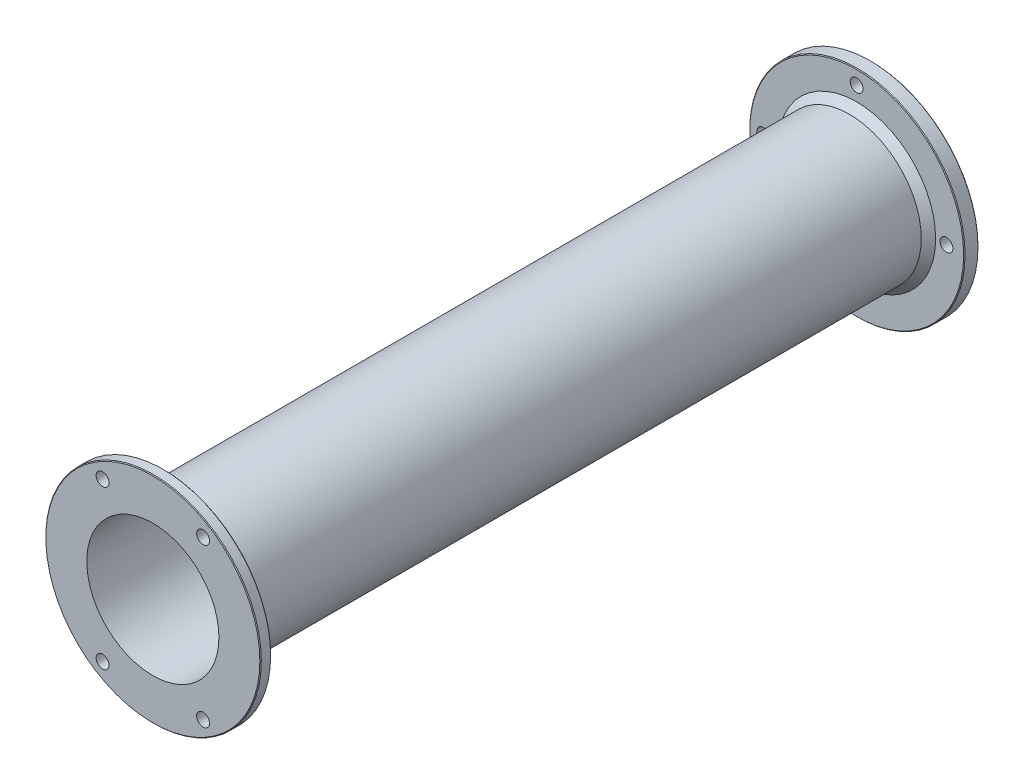
ISO-10303-21;
HEADER;
FILE_DESCRIPTION(('STEP AP214'),'2;1');
FILE_NAME('part.step','',(''),(''),'','','');
FILE_SCHEMA(('AUTOMOTIVE_DESIGN { 1 0 10303 214 1 1 1 1 }'));
ENDSEC;
DATA;
#1=APPLICATION_CONTEXT('core data for automotive mechanical design processes');
#2=APPLICATION_PROTOCOL_DEFINITION('international standard','automotive_design',2000,#1);
#3=PRODUCT_CONTEXT('',#1,'mechanical');
#4=PRODUCT('Part','Part','',(#3));
#5=PRODUCT_RELATED_PRODUCT_CATEGORY('part','',(#4));
#6=PRODUCT_DEFINITION_FORMATION('','',#4);
#7=PRODUCT_DEFINITION_CONTEXT('part definition',#1,'design');
#8=PRODUCT_DEFINITION('design','',#6,#7);
#9=PRODUCT_DEFINITION_SHAPE('','',#8);
#10=(LENGTH_UNIT() NAMED_UNIT(*) SI_UNIT(.MILLI.,.METRE.));
#11=(NAMED_UNIT(*) PLANE_ANGLE_UNIT() SI_UNIT($,.RADIAN.));
#12=(NAMED_UNIT(*) SI_UNIT($,.STERADIAN.) SOLID_ANGLE_UNIT());
#13=UNCERTAINTY_MEASURE_WITH_UNIT(LENGTH_MEASURE(1.E-05),#10,'distance_accuracy_value','');
#14=(GEOMETRIC_REPRESENTATION_CONTEXT(3) GLOBAL_UNCERTAINTY_ASSIGNED_CONTEXT((#13)) GLOBAL_UNIT_ASSIGNED_CONTEXT((#10,
#11,#12)) REPRESENTATION_CONTEXT('',''));
#15=CARTESIAN_POINT('',(0.,0.,0.));
#16=DIRECTION('',(0.,0.,1.));
#17=DIRECTION('',(1.,0.,0.));
#18=AXIS2_PLACEMENT_3D('',#15,#16,#17);
#19=CARTESIAN_POINT('',(0.,0.,20.));
#20=DIRECTION('',(0.,0.,1.));
#21=DIRECTION('',(1.,0.,0.));
#22=AXIS2_PLACEMENT_3D('',#19,#20,#21);
#23=PLANE('',#22);
#24=CARTESIAN_POINT('',(0.,0.,20.));
#25=DIRECTION('',(0.,0.,1.));
#26=DIRECTION('',(1.,0.,0.));
#27=AXIS2_PLACEMENT_3D('',#24,#25,#26);
#28=CIRCLE('',#27,149.);
#29=CARTESIAN_POINT('',(149.,0.,20.));
#30=VERTEX_POINT('',#29);
#31=EDGE_CURVE('E70',#30,#30,#28,.T.);
#32=ORIENTED_EDGE('',*,*,#31,.T.);
#33=EDGE_LOOP('',(#32));
#34=FACE_BOUND('',#33,.T.);
#35=CARTESIAN_POINT('',(0.,0.,20.));
#36=DIRECTION('',(0.,0.,1.));
#37=DIRECTION('',(1.,0.,0.));
#38=AXIS2_PLACEMENT_3D('',#35,#36,#37);
#39=CIRCLE('',#38,110.);
#40=CARTESIAN_POINT('',(110.,0.,20.));
#41=VERTEX_POINT('',#40);
#42=EDGE_CURVE('E86',#41,#41,#39,.F.);
#43=ORIENTED_EDGE('',*,*,#42,.T.);
#44=EDGE_LOOP('',(#43));
#45=FACE_BOUND('',#44,.T.);
#46=CARTESIAN_POINT('',(-130.,5.00000000000007,20.));
#47=DIRECTION('',(0.,0.,1.));
#48=DIRECTION('',(1.,0.,0.));
#49=AXIS2_PLACEMENT_3D('',#46,#47,#48);
#50=CIRCLE('',#49,9.00000000000001);
#51=CARTESIAN_POINT('',(-121.,5.00000000000007,20.));
#52=VERTEX_POINT('',#51);
#53=EDGE_CURVE('E127',#52,#52,#50,.T.);
#54=ORIENTED_EDGE('',*,*,#53,.F.);
#55=EDGE_LOOP('',(#54));
#56=FACE_BOUND('',#55,.T.);
#57=CARTESIAN_POINT('',(125.,-4.36435167355392E-13,20.));
#58=DIRECTION('',(0.,0.,1.));
#59=DIRECTION('',(1.,0.,0.));
#60=AXIS2_PLACEMENT_3D('',#57,#58,#59);
#61=CIRCLE('',#60,9.00000000000001);
#62=CARTESIAN_POINT('',(134.,-4.36435167355392E-13,20.));
#63=VERTEX_POINT('',#62);
#64=EDGE_CURVE('E111',#63,#63,#61,.T.);
#65=ORIENTED_EDGE('',*,*,#64,.F.);
#66=EDGE_LOOP('',(#65));
#67=FACE_BOUND('',#66,.T.);
#68=CARTESIAN_POINT('',(0.,130.,20.));
#69=DIRECTION('',(0.,0.,1.));
#70=DIRECTION('',(1.,0.,0.));
#71=AXIS2_PLACEMENT_3D('',#68,#69,#70);
#72=CIRCLE('',#71,9.00000000000001);
#73=CARTESIAN_POINT('',(9.00000000000001,130.,20.));
#74=VERTEX_POINT('',#73);
#75=EDGE_CURVE('E106',#74,#74,#72,.T.);
#76=ORIENTED_EDGE('',*,*,#75,.F.);
#77=EDGE_LOOP('',(#76));
#78=FACE_BOUND('',#77,.T.);
#79=CARTESIAN_POINT('',(-5.00000000000045,-125.,20.));
#80=DIRECTION('',(0.,0.,1.));
#81=DIRECTION('',(1.,0.,0.));
#82=AXIS2_PLACEMENT_3D('',#79,#80,#81);
#83=CIRCLE('',#82,8.99999999999999);
#84=CARTESIAN_POINT('',(3.99999999999954,-125.,20.));
#85=VERTEX_POINT('',#84);
#86=EDGE_CURVE('E119',#85,#85,#83,.T.);
#87=ORIENTED_EDGE('',*,*,#86,.F.);
#88=EDGE_LOOP('',(#87));
#89=FACE_BOUND('',#88,.T.);
#90=ADVANCED_FACE('F45',(#34,#45,#56,#67,#78,#89),#23,.T.);
#91=CARTESIAN_POINT('',(0.,0.,0.));
#92=DIRECTION('',(0.,0.,1.));
#93=DIRECTION('',(1.,0.,0.));
#94=AXIS2_PLACEMENT_3D('',#91,#92,#93);
#95=PLANE('',#94);
#96=CARTESIAN_POINT('',(0.,0.,0.));
#97=DIRECTION('',(0.,0.,1.));
#98=DIRECTION('',(1.,0.,0.));
#99=AXIS2_PLACEMENT_3D('',#96,#97,#98);
#100=CIRCLE('',#99,149.);
#101=CARTESIAN_POINT('',(149.,0.,0.));
#102=VERTEX_POINT('',#101);
#103=EDGE_CURVE('E74',#102,#102,#100,.F.);
#104=ORIENTED_EDGE('',*,*,#103,.T.);
#105=EDGE_LOOP('',(#104));
#106=FACE_BOUND('',#105,.T.);
#107=CARTESIAN_POINT('',(0.,0.,0.));
#108=DIRECTION('',(0.,0.,1.));
#109=DIRECTION('',(1.,0.,0.));
#110=AXIS2_PLACEMENT_3D('',#107,#108,#109);
#111=CIRCLE('',#110,92.);
#112=CARTESIAN_POINT('',(92.,0.,0.));
#113=VERTEX_POINT('',#112);
#114=EDGE_CURVE('E102',#113,#113,#111,.T.);
#115=ORIENTED_EDGE('',*,*,#114,.T.);
#116=EDGE_LOOP('',(#115));
#117=FACE_BOUND('',#116,.T.);
#118=CARTESIAN_POINT('',(0.,130.,0.));
#119=DIRECTION('',(0.,0.,1.));
#120=DIRECTION('',(1.,0.,0.));
#121=AXIS2_PLACEMENT_3D('',#118,#119,#120);
#122=CIRCLE('',#121,9.00000000000001);
#123=CARTESIAN_POINT('',(9.00000000000001,130.,0.));
#124=VERTEX_POINT('',#123);
#125=EDGE_CURVE('E107',#124,#124,#122,.T.);
#126=ORIENTED_EDGE('',*,*,#125,.T.);
#127=EDGE_LOOP('',(#126));
#128=FACE_BOUND('',#127,.T.);
#129=CARTESIAN_POINT('',(125.,-4.36435167355392E-13,0.));
#130=DIRECTION('',(0.,0.,1.));
#131=DIRECTION('',(1.,0.,0.));
#132=AXIS2_PLACEMENT_3D('',#129,#130,#131);
#133=CIRCLE('',#132,9.00000000000001);
#134=CARTESIAN_POINT('',(134.,-4.36435167355392E-13,0.));
#135=VERTEX_POINT('',#134);
#136=EDGE_CURVE('E115',#135,#135,#133,.T.);
#137=ORIENTED_EDGE('',*,*,#136,.T.);
#138=EDGE_LOOP('',(#137));
#139=FACE_BOUND('',#138,.T.);
#140=CARTESIAN_POINT('',(-5.00000000000045,-125.,0.));
#141=DIRECTION('',(0.,0.,1.));
#142=DIRECTION('',(1.,0.,0.));
#143=AXIS2_PLACEMENT_3D('',#140,#141,#142);
#144=CIRCLE('',#143,8.99999999999999);
#145=CARTESIAN_POINT('',(3.99999999999954,-125.,0.));
#146=VERTEX_POINT('',#145);
#147=EDGE_CURVE('E123',#146,#146,#144,.T.);
#148=ORIENTED_EDGE('',*,*,#147,.T.);
#149=EDGE_LOOP('',(#148));
#150=FACE_BOUND('',#149,.T.);
#151=CARTESIAN_POINT('',(-130.,5.00000000000007,0.));
#152=DIRECTION('',(0.,0.,1.));
#153=DIRECTION('',(1.,0.,0.));
#154=AXIS2_PLACEMENT_3D('',#151,#152,#153);
#155=CIRCLE('',#154,9.00000000000001);
#156=CARTESIAN_POINT('',(-121.,5.00000000000007,0.));
#157=VERTEX_POINT('',#156);
#158=EDGE_CURVE('E131',#157,#157,#155,.T.);
#159=ORIENTED_EDGE('',*,*,#158,.T.);
#160=EDGE_LOOP('',(#159));
#161=FACE_BOUND('',#160,.T.);
#162=ADVANCED_FACE('F196',(#106,#117,#128,#139,#150,#161),#95,.F.);
#163=CARTESIAN_POINT('',(0.,0.,20.));
#164=DIRECTION('',(0.,0.,-1.));
#165=DIRECTION('',(-1.,0.,0.));
#166=AXIS2_PLACEMENT_3D('',#163,#164,#165);
#167=CYLINDRICAL_SURFACE('',#166,150.);
#168=CARTESIAN_POINT('',(0.,0.,0.99999999999989));
#169=DIRECTION('',(0.,0.,1.));
#170=DIRECTION('',(1.,0.,0.));
#171=AXIS2_PLACEMENT_3D('',#168,#169,#170);
#172=CIRCLE('',#171,150.);
#173=CARTESIAN_POINT('',(150.,0.,0.99999999999989));
#174=VERTEX_POINT('',#173);
#175=EDGE_CURVE('E78',#174,#174,#172,.T.);
#176=ORIENTED_EDGE('',*,*,#175,.T.);
#177=EDGE_LOOP('',(#176));
#178=FACE_BOUND('',#177,.T.);
#179=CARTESIAN_POINT('',(0.,0.,18.9999999999998));
#180=DIRECTION('',(0.,0.,1.));
#181=DIRECTION('',(1.,0.,0.));
#182=AXIS2_PLACEMENT_3D('',#179,#180,#181);
#183=CIRCLE('',#182,150.);
#184=CARTESIAN_POINT('',(150.,0.,18.9999999999998));
#185=VERTEX_POINT('',#184);
#186=EDGE_CURVE('E82',#185,#185,#183,.F.);
#187=ORIENTED_EDGE('',*,*,#186,.T.);
#188=EDGE_LOOP('',(#187));
#189=FACE_BOUND('',#188,.T.);
#190=ADVANCED_FACE('F203',(#178,#189),#167,.T.);
#191=CARTESIAN_POINT('',(0.,0.,20.));
#192=DIRECTION('',(0.,0.,-1.));
#193=DIRECTION('',(-1.,0.,0.));
#194=AXIS2_PLACEMENT_3D('',#191,#192,#193);
#195=CYLINDRICAL_SURFACE('',#194,92.);
#196=ORIENTED_EDGE('',*,*,#114,.F.);
#197=EDGE_LOOP('',(#196));
#198=FACE_BOUND('',#197,.T.);
#199=CARTESIAN_POINT('',(0.,0.,1000.));
#200=DIRECTION('',(0.,0.,1.));
#201=DIRECTION('',(1.,0.,0.));
#202=AXIS2_PLACEMENT_3D('',#199,#200,#201);
#203=CIRCLE('',#202,92.);
#204=CARTESIAN_POINT('',(92.,0.,1000.));
#205=VERTEX_POINT('',#204);
#206=EDGE_CURVE('E135',#205,#205,#203,.T.);
#207=ORIENTED_EDGE('',*,*,#206,.T.);
#208=EDGE_LOOP('',(#207));
#209=FACE_BOUND('',#208,.T.);
#210=ADVANCED_FACE('F208',(#198,#209),#195,.F.);
#211=CARTESIAN_POINT('',(0.,130.,20.));
#212=DIRECTION('',(0.,0.,-1.));
#213=DIRECTION('',(-1.,0.,0.));
#214=AXIS2_PLACEMENT_3D('',#211,#212,#213);
#215=CYLINDRICAL_SURFACE('',#214,9.00000000000001);
#216=ORIENTED_EDGE('',*,*,#75,.T.);
#217=EDGE_LOOP('',(#216));
#218=FACE_BOUND('',#217,.T.);
#219=ORIENTED_EDGE('',*,*,#125,.F.);
#220=EDGE_LOOP('',(#219));
#221=FACE_BOUND('',#220,.T.);
#222=ADVANCED_FACE('F273',(#218,#221),#215,.F.);
#223=CARTESIAN_POINT('',(125.,-4.36435167355392E-13,20.));
#224=DIRECTION('',(0.,0.,-1.));
#225=DIRECTION('',(-1.,0.,0.));
#226=AXIS2_PLACEMENT_3D('',#223,#224,#225);
#227=CYLINDRICAL_SURFACE('',#226,9.00000000000001);
#228=ORIENTED_EDGE('',*,*,#64,.T.);
#229=EDGE_LOOP('',(#228));
#230=FACE_BOUND('',#229,.T.);
#231=ORIENTED_EDGE('',*,*,#136,.F.);
#232=EDGE_LOOP('',(#231));
#233=FACE_BOUND('',#232,.T.);
#234=ADVANCED_FACE('F270',(#230,#233),#227,.F.);
#235=CARTESIAN_POINT('',(-5.00000000000045,-125.,20.));
#236=DIRECTION('',(0.,0.,-1.));
#237=DIRECTION('',(-1.,0.,0.));
#238=AXIS2_PLACEMENT_3D('',#235,#236,#237);
#239=CYLINDRICAL_SURFACE('',#238,8.99999999999999);
#240=ORIENTED_EDGE('',*,*,#86,.T.);
#241=EDGE_LOOP('',(#240));
#242=FACE_BOUND('',#241,.T.);
#243=ORIENTED_EDGE('',*,*,#147,.F.);
#244=EDGE_LOOP('',(#243));
#245=FACE_BOUND('',#244,.T.);
#246=ADVANCED_FACE('F266',(#242,#245),#239,.F.);
#247=CARTESIAN_POINT('',(-130.,5.00000000000007,20.));
#248=DIRECTION('',(0.,0.,-1.));
#249=DIRECTION('',(-1.,0.,0.));
#250=AXIS2_PLACEMENT_3D('',#247,#248,#249);
#251=CYLINDRICAL_SURFACE('',#250,9.00000000000001);
#252=ORIENTED_EDGE('',*,*,#53,.T.);
#253=EDGE_LOOP('',(#252));
#254=FACE_BOUND('',#253,.T.);
#255=ORIENTED_EDGE('',*,*,#158,.F.);
#256=EDGE_LOOP('',(#255));
#257=FACE_BOUND('',#256,.T.);
#258=ADVANCED_FACE('F190',(#254,#257),#251,.F.);
#259=CARTESIAN_POINT('',(0.,0.,985.));
#260=DIRECTION('',(0.,0.,-1.));
#261=DIRECTION('',(-1.,0.,0.));
#262=AXIS2_PLACEMENT_3D('',#259,#260,#261);
#263=CYLINDRICAL_SURFACE('',#262,100.);
#264=CARTESIAN_POINT('',(0.,0.,975.));
#265=DIRECTION('',(0.,0.,1.));
#266=DIRECTION('',(1.,0.,0.));
#267=AXIS2_PLACEMENT_3D('',#264,#265,#266);
#268=CIRCLE('',#267,100.);
#269=CARTESIAN_POINT('',(100.,0.,975.));
#270=VERTEX_POINT('',#269);
#271=EDGE_CURVE('E90',#270,#270,#268,.F.);
#272=ORIENTED_EDGE('',*,*,#271,.T.);
#273=EDGE_LOOP('',(#272));
#274=FACE_BOUND('',#273,.T.);
#275=CARTESIAN_POINT('',(0.,0.,29.9999999999999));
#276=DIRECTION('',(0.,0.,1.));
#277=DIRECTION('',(1.,0.,0.));
#278=AXIS2_PLACEMENT_3D('',#275,#276,#277);
#279=CIRCLE('',#278,100.);
#280=CARTESIAN_POINT('',(100.,0.,29.9999999999999));
#281=VERTEX_POINT('',#280);
#282=EDGE_CURVE('E94',#281,#281,#279,.T.);
#283=ORIENTED_EDGE('',*,*,#282,.T.);
#284=EDGE_LOOP('',(#283));
#285=FACE_BOUND('',#284,.T.);
#286=ADVANCED_FACE('F181',(#274,#285),#263,.T.);
#287=CARTESIAN_POINT('',(0.,0.,1000.));
#288=DIRECTION('',(0.,0.,1.));
#289=DIRECTION('',(1.,0.,0.));
#290=AXIS2_PLACEMENT_3D('',#287,#288,#289);
#291=PLANE('',#290);
#292=CARTESIAN_POINT('',(0.,0.,1000.));
#293=DIRECTION('',(0.,0.,1.));
#294=DIRECTION('',(1.,0.,0.));
#295=AXIS2_PLACEMENT_3D('',#292,#293,#294);
#296=CIRCLE('',#295,149.);
#297=CARTESIAN_POINT('',(149.,0.,1000.));
#298=VERTEX_POINT('',#297);
#299=EDGE_CURVE('E10',#298,#298,#296,.T.);
#300=ORIENTED_EDGE('',*,*,#299,.T.);
#301=EDGE_LOOP('',(#300));
#302=FACE_BOUND('',#301,.T.);
#303=CARTESIAN_POINT('',(70.,-110.,1000.));
#304=DIRECTION('',(0.,0.,1.));
#305=DIRECTION('',(1.,0.,0.));
#306=AXIS2_PLACEMENT_3D('',#303,#304,#305);
#307=CIRCLE('',#306,8.99999999999999);
#308=CARTESIAN_POINT('',(79.,-110.,1000.));
#309=VERTEX_POINT('',#308);
#310=EDGE_CURVE('E155',#309,#309,#307,.T.);
#311=ORIENTED_EDGE('',*,*,#310,.F.);
#312=EDGE_LOOP('',(#311));
#313=FACE_BOUND('',#312,.T.);
#314=CARTESIAN_POINT('',(-70.,110.,1000.));
#315=DIRECTION('',(0.,0.,1.));
#316=DIRECTION('',(1.,0.,0.));
#317=AXIS2_PLACEMENT_3D('',#314,#315,#316);
#318=CIRCLE('',#317,9.00000000000001);
#319=CARTESIAN_POINT('',(-61.,110.,1000.));
#320=VERTEX_POINT('',#319);
#321=EDGE_CURVE('E142',#320,#320,#318,.T.);
#322=ORIENTED_EDGE('',*,*,#321,.F.);
#323=EDGE_LOOP('',(#322));
#324=FACE_BOUND('',#323,.T.);
#325=ORIENTED_EDGE('',*,*,#206,.F.);
#326=EDGE_LOOP('',(#325));
#327=FACE_BOUND('',#326,.T.);
#328=CARTESIAN_POINT('',(70.,110.,1000.));
#329=DIRECTION('',(0.,0.,1.));
#330=DIRECTION('',(1.,0.,0.));
#331=AXIS2_PLACEMENT_3D('',#328,#329,#330);
#332=CIRCLE('',#331,8.99999999999999);
#333=CARTESIAN_POINT('',(79.,110.,1000.));
#334=VERTEX_POINT('',#333);
#335=EDGE_CURVE('E147',#334,#334,#332,.T.);
#336=ORIENTED_EDGE('',*,*,#335,.F.);
#337=EDGE_LOOP('',(#336));
#338=FACE_BOUND('',#337,.T.);
#339=CARTESIAN_POINT('',(-70.,-110.,1000.));
#340=DIRECTION('',(0.,0.,1.));
#341=DIRECTION('',(1.,0.,0.));
#342=AXIS2_PLACEMENT_3D('',#339,#340,#341);
#343=CIRCLE('',#342,9.00000000000001);
#344=CARTESIAN_POINT('',(-61.,-110.,1000.));
#345=VERTEX_POINT('',#344);
#346=EDGE_CURVE('E163',#345,#345,#343,.T.);
#347=ORIENTED_EDGE('',*,*,#346,.F.);
#348=EDGE_LOOP('',(#347));
#349=FACE_BOUND('',#348,.T.);
#350=ADVANCED_FACE('F178',(#302,#313,#324,#327,#338,#349),#291,.T.);
#351=CARTESIAN_POINT('',(0.,0.,985.));
#352=DIRECTION('',(0.,0.,1.));
#353=DIRECTION('',(1.,0.,0.));
#354=AXIS2_PLACEMENT_3D('',#351,#352,#353);
#355=PLANE('',#354);
#356=CARTESIAN_POINT('',(0.,0.,985.));
#357=DIRECTION('',(0.,0.,1.));
#358=DIRECTION('',(1.,0.,0.));
#359=AXIS2_PLACEMENT_3D('',#356,#357,#358);
#360=CIRCLE('',#359,149.);
#361=CARTESIAN_POINT('',(149.,0.,985.));
#362=VERTEX_POINT('',#361);
#363=EDGE_CURVE('E54',#362,#362,#360,.F.);
#364=ORIENTED_EDGE('',*,*,#363,.T.);
#365=EDGE_LOOP('',(#364));
#366=FACE_BOUND('',#365,.T.);
#367=CARTESIAN_POINT('',(0.,0.,985.));
#368=DIRECTION('',(0.,0.,1.));
#369=DIRECTION('',(1.,0.,0.));
#370=AXIS2_PLACEMENT_3D('',#367,#368,#369);
#371=CIRCLE('',#370,110.);
#372=CARTESIAN_POINT('',(110.,0.,985.));
#373=VERTEX_POINT('',#372);
#374=EDGE_CURVE('E98',#373,#373,#371,.T.);
#375=ORIENTED_EDGE('',*,*,#374,.T.);
#376=EDGE_LOOP('',(#375));
#377=FACE_BOUND('',#376,.T.);
#378=CARTESIAN_POINT('',(-70.,110.,985.));
#379=DIRECTION('',(0.,0.,1.));
#380=DIRECTION('',(1.,0.,0.));
#381=AXIS2_PLACEMENT_3D('',#378,#379,#380);
#382=CIRCLE('',#381,9.00000000000001);
#383=CARTESIAN_POINT('',(-61.,110.,985.));
#384=VERTEX_POINT('',#383);
#385=EDGE_CURVE('E143',#384,#384,#382,.T.);
#386=ORIENTED_EDGE('',*,*,#385,.T.);
#387=EDGE_LOOP('',(#386));
#388=FACE_BOUND('',#387,.T.);
#389=CARTESIAN_POINT('',(70.,110.,985.));
#390=DIRECTION('',(0.,0.,1.));
#391=DIRECTION('',(1.,0.,0.));
#392=AXIS2_PLACEMENT_3D('',#389,#390,#391);
#393=CIRCLE('',#392,8.99999999999999);
#394=CARTESIAN_POINT('',(79.,110.,985.));
#395=VERTEX_POINT('',#394);
#396=EDGE_CURVE('E151',#395,#395,#393,.T.);
#397=ORIENTED_EDGE('',*,*,#396,.T.);
#398=EDGE_LOOP('',(#397));
#399=FACE_BOUND('',#398,.T.);
#400=CARTESIAN_POINT('',(70.,-110.,985.));
#401=DIRECTION('',(0.,0.,1.));
#402=DIRECTION('',(1.,0.,0.));
#403=AXIS2_PLACEMENT_3D('',#400,#401,#402);
#404=CIRCLE('',#403,8.99999999999999);
#405=CARTESIAN_POINT('',(79.,-110.,985.));
#406=VERTEX_POINT('',#405);
#407=EDGE_CURVE('E159',#406,#406,#404,.T.);
#408=ORIENTED_EDGE('',*,*,#407,.T.);
#409=EDGE_LOOP('',(#408));
#410=FACE_BOUND('',#409,.T.);
#411=CARTESIAN_POINT('',(-70.,-110.,985.));
#412=DIRECTION('',(0.,0.,1.));
#413=DIRECTION('',(1.,0.,0.));
#414=AXIS2_PLACEMENT_3D('',#411,#412,#413);
#415=CIRCLE('',#414,9.00000000000001);
#416=CARTESIAN_POINT('',(-61.,-110.,985.));
#417=VERTEX_POINT('',#416);
#418=EDGE_CURVE('E167',#417,#417,#415,.T.);
#419=ORIENTED_EDGE('',*,*,#418,.T.);
#420=EDGE_LOOP('',(#419));
#421=FACE_BOUND('',#420,.T.);
#422=ADVANCED_FACE('F180',(#366,#377,#388,#399,#410,#421),#355,.F.);
#423=CARTESIAN_POINT('',(0.,0.,1000.));
#424=DIRECTION('',(0.,0.,-1.));
#425=DIRECTION('',(-1.,0.,0.));
#426=AXIS2_PLACEMENT_3D('',#423,#424,#425);
#427=CYLINDRICAL_SURFACE('',#426,150.);
#428=CARTESIAN_POINT('',(0.,0.,986.));
#429=DIRECTION('',(0.,0.,1.));
#430=DIRECTION('',(1.,0.,0.));
#431=AXIS2_PLACEMENT_3D('',#428,#429,#430);
#432=CIRCLE('',#431,150.);
#433=CARTESIAN_POINT('',(150.,0.,986.));
#434=VERTEX_POINT('',#433);
#435=EDGE_CURVE('E59',#434,#434,#432,.T.);
#436=ORIENTED_EDGE('',*,*,#435,.T.);
#437=EDGE_LOOP('',(#436));
#438=FACE_BOUND('',#437,.T.);
#439=CARTESIAN_POINT('',(0.,0.,999.));
#440=DIRECTION('',(0.,0.,1.));
#441=DIRECTION('',(1.,0.,0.));
#442=AXIS2_PLACEMENT_3D('',#439,#440,#441);
#443=CIRCLE('',#442,150.);
#444=CARTESIAN_POINT('',(150.,0.,999.));
#445=VERTEX_POINT('',#444);
#446=EDGE_CURVE('E64',#445,#445,#443,.F.);
#447=ORIENTED_EDGE('',*,*,#446,.T.);
#448=EDGE_LOOP('',(#447));
#449=FACE_BOUND('',#448,.T.);
#450=ADVANCED_FACE('F187',(#438,#449),#427,.T.);
#451=CARTESIAN_POINT('',(-70.,110.,1000.));
#452=DIRECTION('',(0.,0.,-1.));
#453=DIRECTION('',(-1.,0.,0.));
#454=AXIS2_PLACEMENT_3D('',#451,#452,#453);
#455=CYLINDRICAL_SURFACE('',#454,9.00000000000001);
#456=ORIENTED_EDGE('',*,*,#321,.T.);
#457=EDGE_LOOP('',(#456));
#458=FACE_BOUND('',#457,.T.);
#459=ORIENTED_EDGE('',*,*,#385,.F.);
#460=EDGE_LOOP('',(#459));
#461=FACE_BOUND('',#460,.T.);
#462=ADVANCED_FACE('F254',(#458,#461),#455,.F.);
#463=CARTESIAN_POINT('',(70.,110.,1000.));
#464=DIRECTION('',(0.,0.,-1.));
#465=DIRECTION('',(-1.,0.,0.));
#466=AXIS2_PLACEMENT_3D('',#463,#464,#465);
#467=CYLINDRICAL_SURFACE('',#466,8.99999999999999);
#468=ORIENTED_EDGE('',*,*,#335,.T.);
#469=EDGE_LOOP('',(#468));
#470=FACE_BOUND('',#469,.T.);
#471=ORIENTED_EDGE('',*,*,#396,.F.);
#472=EDGE_LOOP('',(#471));
#473=FACE_BOUND('',#472,.T.);
#474=ADVANCED_FACE('F261',(#470,#473),#467,.F.);
#475=CARTESIAN_POINT('',(70.,-110.,1000.));
#476=DIRECTION('',(0.,0.,-1.));
#477=DIRECTION('',(-1.,0.,0.));
#478=AXIS2_PLACEMENT_3D('',#475,#476,#477);
#479=CYLINDRICAL_SURFACE('',#478,8.99999999999999);
#480=ORIENTED_EDGE('',*,*,#310,.T.);
#481=EDGE_LOOP('',(#480));
#482=FACE_BOUND('',#481,.T.);
#483=ORIENTED_EDGE('',*,*,#407,.F.);
#484=EDGE_LOOP('',(#483));
#485=FACE_BOUND('',#484,.T.);
#486=ADVANCED_FACE('F308',(#482,#485),#479,.F.);
#487=CARTESIAN_POINT('',(-70.,-110.,1000.));
#488=DIRECTION('',(0.,0.,-1.));
#489=DIRECTION('',(-1.,0.,0.));
#490=AXIS2_PLACEMENT_3D('',#487,#488,#489);
#491=CYLINDRICAL_SURFACE('',#490,9.00000000000001);
#492=ORIENTED_EDGE('',*,*,#346,.T.);
#493=EDGE_LOOP('',(#492));
#494=FACE_BOUND('',#493,.T.);
#495=ORIENTED_EDGE('',*,*,#418,.F.);
#496=EDGE_LOOP('',(#495));
#497=FACE_BOUND('',#496,.T.);
#498=ADVANCED_FACE('F175',(#494,#497),#491,.F.);
#499=CARTESIAN_POINT('',(0.,0.,985.));
#500=DIRECTION('',(0.,0.,1.));
#501=DIRECTION('',(1.,0.,0.));
#502=AXIS2_PLACEMENT_3D('',#499,#500,#501);
#503=CONICAL_SURFACE('',#502,110.,0.785398163397457);
#504=ORIENTED_EDGE('',*,*,#271,.F.);
#505=EDGE_LOOP('',(#504));
#506=FACE_BOUND('',#505,.T.);
#507=ORIENTED_EDGE('',*,*,#374,.F.);
#508=EDGE_LOOP('',(#507));
#509=FACE_BOUND('',#508,.T.);
#510=ADVANCED_FACE('F214',(#506,#509),#503,.T.);
#511=CARTESIAN_POINT('',(0.,0.,29.9999999999999));
#512=DIRECTION('',(0.,0.,-1.));
#513=DIRECTION('',(-1.,0.,0.));
#514=AXIS2_PLACEMENT_3D('',#511,#512,#513);
#515=CONICAL_SURFACE('',#514,100.,0.785398163397448);
#516=ORIENTED_EDGE('',*,*,#42,.F.);
#517=EDGE_LOOP('',(#516));
#518=FACE_BOUND('',#517,.T.);
#519=ORIENTED_EDGE('',*,*,#282,.F.);
#520=EDGE_LOOP('',(#519));
#521=FACE_BOUND('',#520,.T.);
#522=ADVANCED_FACE('F220',(#518,#521),#515,.T.);
#523=CARTESIAN_POINT('',(0.,0.,0.99999999999989));
#524=DIRECTION('',(0.,0.,1.));
#525=DIRECTION('',(1.,0.,0.));
#526=AXIS2_PLACEMENT_3D('',#523,#524,#525);
#527=CONICAL_SURFACE('',#526,150.,0.785398163397421);
#528=ORIENTED_EDGE('',*,*,#103,.F.);
#529=EDGE_LOOP('',(#528));
#530=FACE_BOUND('',#529,.T.);
#531=ORIENTED_EDGE('',*,*,#175,.F.);
#532=EDGE_LOOP('',(#531));
#533=FACE_BOUND('',#532,.T.);
#534=ADVANCED_FACE('F226',(#530,#533),#527,.T.);
#535=CARTESIAN_POINT('',(0.,0.,20.));
#536=DIRECTION('',(0.,0.,-1.));
#537=DIRECTION('',(-1.,0.,0.));
#538=AXIS2_PLACEMENT_3D('',#535,#536,#537);
#539=CONICAL_SURFACE('',#538,149.,0.785398163397421);
#540=ORIENTED_EDGE('',*,*,#186,.F.);
#541=EDGE_LOOP('',(#540));
#542=FACE_BOUND('',#541,.T.);
#543=ORIENTED_EDGE('',*,*,#31,.F.);
#544=EDGE_LOOP('',(#543));
#545=FACE_BOUND('',#544,.T.);
#546=ADVANCED_FACE('F233',(#542,#545),#539,.T.);
#547=CARTESIAN_POINT('',(0.,0.,986.));
#548=DIRECTION('',(0.,0.,1.));
#549=DIRECTION('',(1.,0.,0.));
#550=AXIS2_PLACEMENT_3D('',#547,#548,#549);
#551=CONICAL_SURFACE('',#550,150.,0.785398163397448);
#552=ORIENTED_EDGE('',*,*,#363,.F.);
#553=EDGE_LOOP('',(#552));
#554=FACE_BOUND('',#553,.T.);
#555=ORIENTED_EDGE('',*,*,#435,.F.);
#556=EDGE_LOOP('',(#555));
#557=FACE_BOUND('',#556,.T.);
#558=ADVANCED_FACE('F239',(#554,#557),#551,.T.);
#559=CARTESIAN_POINT('',(0.,0.,1000.));
#560=DIRECTION('',(0.,0.,-1.));
#561=DIRECTION('',(-1.,0.,0.));
#562=AXIS2_PLACEMENT_3D('',#559,#560,#561);
#563=CONICAL_SURFACE('',#562,149.,0.785398163397393);
#564=ORIENTED_EDGE('',*,*,#446,.F.);
#565=EDGE_LOOP('',(#564));
#566=FACE_BOUND('',#565,.T.);
#567=ORIENTED_EDGE('',*,*,#299,.F.);
#568=EDGE_LOOP('',(#567));
#569=FACE_BOUND('',#568,.T.);
#570=ADVANCED_FACE('F48',(#566,#569),#563,.T.);
#571=CLOSED_SHELL('',(#90,#162,#190,#210,#222,#234,#246,#258,#286,#350,#422,#450,#462,#474,#486,
#498,#510,#522,#534,#546,#558,#570));
#572=MANIFOLD_SOLID_BREP('B2',#571);
#573=ADVANCED_BREP_SHAPE_REPRESENTATION('',(#18,#572),#14);
#574=SHAPE_DEFINITION_REPRESENTATION(#9,#573);
ENDSEC;
END-ISO-10303-21;
